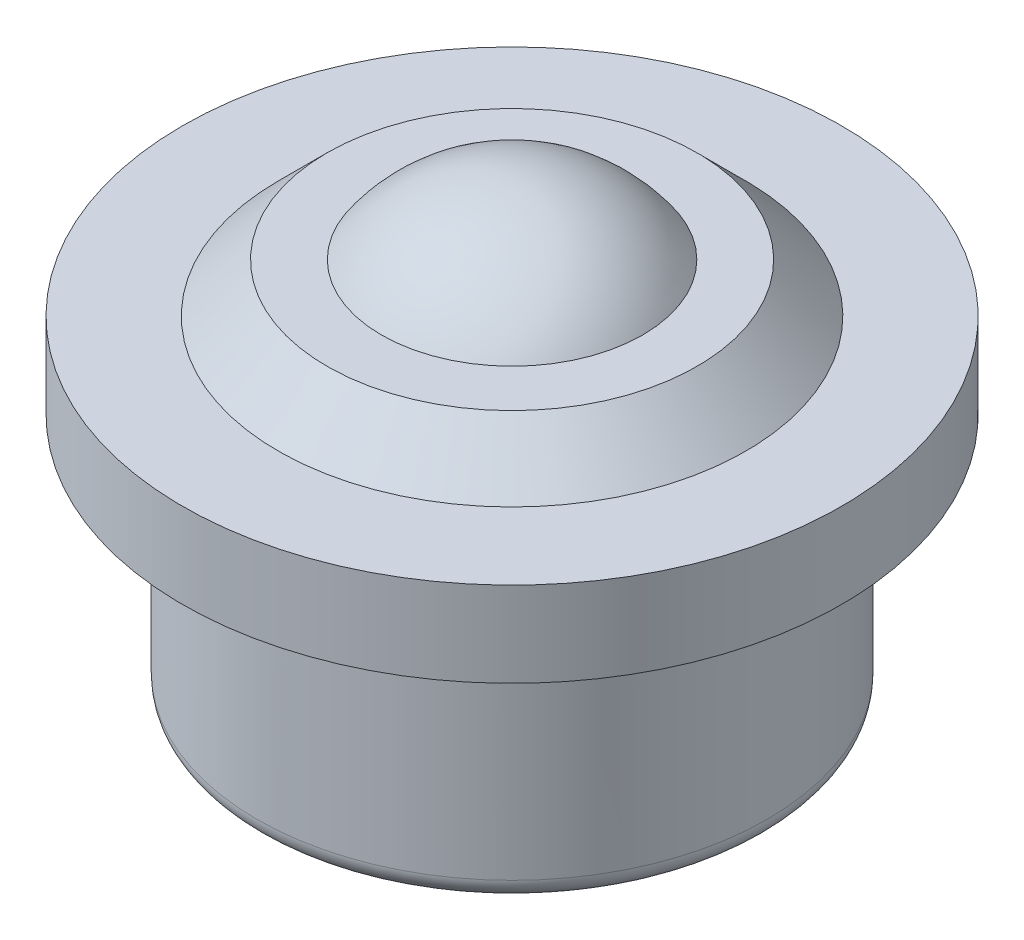
ISO-10303-21;
HEADER;
FILE_DESCRIPTION(('STEP AP214'),'2;1');
FILE_NAME('part.step','',(''),(''),'','','');
FILE_SCHEMA(('AUTOMOTIVE_DESIGN { 1 0 10303 214 1 1 1 1 }'));
ENDSEC;
DATA;
#1=APPLICATION_CONTEXT('core data for automotive mechanical design processes');
#2=APPLICATION_PROTOCOL_DEFINITION('international standard','automotive_design',2000,#1);
#3=PRODUCT_CONTEXT('',#1,'mechanical');
#4=PRODUCT('Part','Part','',(#3));
#5=PRODUCT_RELATED_PRODUCT_CATEGORY('part','',(#4));
#6=PRODUCT_DEFINITION_FORMATION('','',#4);
#7=PRODUCT_DEFINITION_CONTEXT('part definition',#1,'design');
#8=PRODUCT_DEFINITION('design','',#6,#7);
#9=PRODUCT_DEFINITION_SHAPE('','',#8);
#10=(LENGTH_UNIT() NAMED_UNIT(*) SI_UNIT(.MILLI.,.METRE.));
#11=(NAMED_UNIT(*) PLANE_ANGLE_UNIT() SI_UNIT($,.RADIAN.));
#12=(NAMED_UNIT(*) SI_UNIT($,.STERADIAN.) SOLID_ANGLE_UNIT());
#13=UNCERTAINTY_MEASURE_WITH_UNIT(LENGTH_MEASURE(1.E-05),#10,'distance_accuracy_value','');
#14=(GEOMETRIC_REPRESENTATION_CONTEXT(3) GLOBAL_UNCERTAINTY_ASSIGNED_CONTEXT((#13)) GLOBAL_UNIT_ASSIGNED_CONTEXT((#10,
#11,#12)) REPRESENTATION_CONTEXT('',''));
#15=CARTESIAN_POINT('',(0.,0.,0.));
#16=DIRECTION('',(0.,0.,1.));
#17=DIRECTION('',(1.,0.,0.));
#18=AXIS2_PLACEMENT_3D('',#15,#16,#17);
#19=CARTESIAN_POINT('',(0.,-13.5,0.));
#20=DIRECTION('',(0.,-1.,0.));
#21=DIRECTION('',(1.,0.,0.));
#22=AXIS2_PLACEMENT_3D('',#19,#20,#21);
#23=PLANE('',#22);
#24=CARTESIAN_POINT('',(0.,-13.5,0.));
#25=DIRECTION('',(0.,-1.,0.));
#26=DIRECTION('',(1.,0.,0.));
#27=AXIS2_PLACEMENT_3D('',#24,#25,#26);
#28=CIRCLE('',#27,11.);
#29=CARTESIAN_POINT('',(11.,-13.5,0.));
#30=VERTEX_POINT('',#29);
#31=EDGE_CURVE('E10',#30,#30,#28,.T.);
#32=ORIENTED_EDGE('',*,*,#31,.T.);
#33=EDGE_LOOP('',(#32));
#34=FACE_BOUND('',#33,.T.);
#35=ADVANCED_FACE('F32',(#34),#23,.T.);
#36=CARTESIAN_POINT('',(0.,0.,0.));
#37=DIRECTION('',(0.,1.,0.));
#38=DIRECTION('',(1.,0.,0.));
#39=AXIS2_PLACEMENT_3D('',#36,#37,#38);
#40=SPHERICAL_SURFACE('',#39,7.5);
#41=CARTESIAN_POINT('',(0.,4.3,0.));
#42=DIRECTION('',(0.,1.,0.));
#43=DIRECTION('',(-1.,0.,0.));
#44=AXIS2_PLACEMENT_3D('',#41,#42,#43);
#45=CIRCLE('',#44,6.14491659829489);
#46=CARTESIAN_POINT('',(-6.14491659829489,4.3,0.));
#47=VERTEX_POINT('',#46);
#48=EDGE_CURVE('E43',#47,#47,#45,.T.);
#49=ORIENTED_EDGE('',*,*,#48,.T.);
#50=EDGE_LOOP('',(#49));
#51=FACE_BOUND('',#50,.T.);
#52=ADVANCED_FACE('F79',(#51),#40,.T.);
#53=CARTESIAN_POINT('',(-6.14491659829489,4.3,0.));
#54=DIRECTION('',(0.,1.,0.));
#55=DIRECTION('',(-1.,0.,0.));
#56=AXIS2_PLACEMENT_3D('',#53,#54,#55);
#57=PLANE('',#56);
#58=CARTESIAN_POINT('',(0.,4.3,0.));
#59=DIRECTION('',(0.,1.,0.));
#60=DIRECTION('',(-1.,0.,0.));
#61=AXIS2_PLACEMENT_3D('',#58,#59,#60);
#62=CIRCLE('',#61,8.70000000000001);
#63=CARTESIAN_POINT('',(-8.70000000000001,4.3,0.));
#64=VERTEX_POINT('',#63);
#65=EDGE_CURVE('E47',#64,#64,#62,.T.);
#66=ORIENTED_EDGE('',*,*,#65,.T.);
#67=EDGE_LOOP('',(#66));
#68=FACE_BOUND('',#67,.T.);
#69=ORIENTED_EDGE('',*,*,#48,.F.);
#70=EDGE_LOOP('',(#69));
#71=FACE_BOUND('',#70,.T.);
#72=ADVANCED_FACE('F83',(#68,#71),#57,.T.);
#73=CARTESIAN_POINT('',(0.,4.3,0.));
#74=DIRECTION('',(0.,-1.,0.));
#75=DIRECTION('',(1.,0.,0.));
#76=AXIS2_PLACEMENT_3D('',#73,#74,#75);
#77=CONICAL_SURFACE('',#76,8.70000000000001,0.785398163397446);
#78=CARTESIAN_POINT('',(0.,2.,0.));
#79=DIRECTION('',(0.,1.,0.));
#80=DIRECTION('',(-1.,0.,0.));
#81=AXIS2_PLACEMENT_3D('',#78,#79,#80);
#82=CIRCLE('',#81,11.);
#83=CARTESIAN_POINT('',(-11.,2.,0.));
#84=VERTEX_POINT('',#83);
#85=EDGE_CURVE('E52',#84,#84,#82,.T.);
#86=ORIENTED_EDGE('',*,*,#85,.T.);
#87=EDGE_LOOP('',(#86));
#88=FACE_BOUND('',#87,.T.);
#89=ORIENTED_EDGE('',*,*,#65,.F.);
#90=EDGE_LOOP('',(#89));
#91=FACE_BOUND('',#90,.T.);
#92=ADVANCED_FACE('F89',(#88,#91),#77,.T.);
#93=CARTESIAN_POINT('',(-11.,2.,0.));
#94=DIRECTION('',(0.,1.,0.));
#95=DIRECTION('',(-1.,0.,0.));
#96=AXIS2_PLACEMENT_3D('',#93,#94,#95);
#97=PLANE('',#96);
#98=CARTESIAN_POINT('',(0.,2.,0.));
#99=DIRECTION('',(0.,1.,0.));
#100=DIRECTION('',(-1.,0.,0.));
#101=AXIS2_PLACEMENT_3D('',#98,#99,#100);
#102=CIRCLE('',#101,15.5);
#103=CARTESIAN_POINT('',(-15.5,2.,0.));
#104=VERTEX_POINT('',#103);
#105=EDGE_CURVE('E55',#104,#104,#102,.T.);
#106=ORIENTED_EDGE('',*,*,#105,.T.);
#107=EDGE_LOOP('',(#106));
#108=FACE_BOUND('',#107,.T.);
#109=ORIENTED_EDGE('',*,*,#85,.F.);
#110=EDGE_LOOP('',(#109));
#111=FACE_BOUND('',#110,.T.);
#112=ADVANCED_FACE('F93',(#108,#111),#97,.T.);
#113=CARTESIAN_POINT('',(0.,7.5,0.));
#114=DIRECTION('',(0.,1.,0.));
#115=DIRECTION('',(-1.,0.,0.));
#116=AXIS2_PLACEMENT_3D('',#113,#114,#115);
#117=CYLINDRICAL_SURFACE('',#116,15.5);
#118=CARTESIAN_POINT('',(0.,-2.,0.));
#119=DIRECTION('',(0.,1.,0.));
#120=DIRECTION('',(-1.,0.,0.));
#121=AXIS2_PLACEMENT_3D('',#118,#119,#120);
#122=CIRCLE('',#121,15.5);
#123=CARTESIAN_POINT('',(-15.5,-2.,0.));
#124=VERTEX_POINT('',#123);
#125=EDGE_CURVE('E58',#124,#124,#122,.T.);
#126=ORIENTED_EDGE('',*,*,#125,.T.);
#127=EDGE_LOOP('',(#126));
#128=FACE_BOUND('',#127,.T.);
#129=ORIENTED_EDGE('',*,*,#105,.F.);
#130=EDGE_LOOP('',(#129));
#131=FACE_BOUND('',#130,.T.);
#132=ADVANCED_FACE('F76',(#128,#131),#117,.T.);
#133=CARTESIAN_POINT('',(-12.,-2.,0.));
#134=DIRECTION('',(0.,-1.,0.));
#135=DIRECTION('',(1.,0.,0.));
#136=AXIS2_PLACEMENT_3D('',#133,#134,#135);
#137=PLANE('',#136);
#138=CARTESIAN_POINT('',(0.,-2.,0.));
#139=DIRECTION('',(0.,1.,0.));
#140=DIRECTION('',(-1.,0.,0.));
#141=AXIS2_PLACEMENT_3D('',#138,#139,#140);
#142=CIRCLE('',#141,12.);
#143=CARTESIAN_POINT('',(-12.,-2.,0.));
#144=VERTEX_POINT('',#143);
#145=EDGE_CURVE('E61',#144,#144,#142,.T.);
#146=ORIENTED_EDGE('',*,*,#145,.T.);
#147=EDGE_LOOP('',(#146));
#148=FACE_BOUND('',#147,.T.);
#149=ORIENTED_EDGE('',*,*,#125,.F.);
#150=EDGE_LOOP('',(#149));
#151=FACE_BOUND('',#150,.T.);
#152=ADVANCED_FACE('F65',(#148,#151),#137,.T.);
#153=CARTESIAN_POINT('',(0.,7.5,0.));
#154=DIRECTION('',(0.,1.,0.));
#155=DIRECTION('',(-1.,0.,0.));
#156=AXIS2_PLACEMENT_3D('',#153,#154,#155);
#157=CYLINDRICAL_SURFACE('',#156,12.);
#158=CARTESIAN_POINT('',(0.,-12.5,0.));
#159=DIRECTION('',(0.,-1.,0.));
#160=DIRECTION('',(1.,0.,0.));
#161=AXIS2_PLACEMENT_3D('',#158,#159,#160);
#162=CIRCLE('',#161,12.);
#163=CARTESIAN_POINT('',(12.,-12.5,0.));
#164=VERTEX_POINT('',#163);
#165=EDGE_CURVE('E39',#164,#164,#162,.F.);
#166=ORIENTED_EDGE('',*,*,#165,.T.);
#167=EDGE_LOOP('',(#166));
#168=FACE_BOUND('',#167,.T.);
#169=ORIENTED_EDGE('',*,*,#145,.F.);
#170=EDGE_LOOP('',(#169));
#171=FACE_BOUND('',#170,.T.);
#172=ADVANCED_FACE('F68',(#168,#171),#157,.T.);
#173=CARTESIAN_POINT('',(0.,-12.5,0.));
#174=DIRECTION('',(0.,-1.,0.));
#175=DIRECTION('',(1.,0.,0.));
#176=AXIS2_PLACEMENT_3D('',#173,#174,#175);
#177=TOROIDAL_SURFACE('',#176,11.,1.);
#178=ORIENTED_EDGE('',*,*,#31,.F.);
#179=EDGE_LOOP('',(#178));
#180=FACE_BOUND('',#179,.T.);
#181=ORIENTED_EDGE('',*,*,#165,.F.);
#182=EDGE_LOOP('',(#181));
#183=FACE_BOUND('',#182,.T.);
#184=ADVANCED_FACE('F34',(#180,#183),#177,.T.);
#185=CLOSED_SHELL('',(#35,#52,#72,#92,#112,#132,#152,#172,#184));
#186=MANIFOLD_SOLID_BREP('B2',#185);
#187=ADVANCED_BREP_SHAPE_REPRESENTATION('',(#18,#186),#14);
#188=SHAPE_DEFINITION_REPRESENTATION(#9,#187);
ENDSEC;
END-ISO-10303-21;
